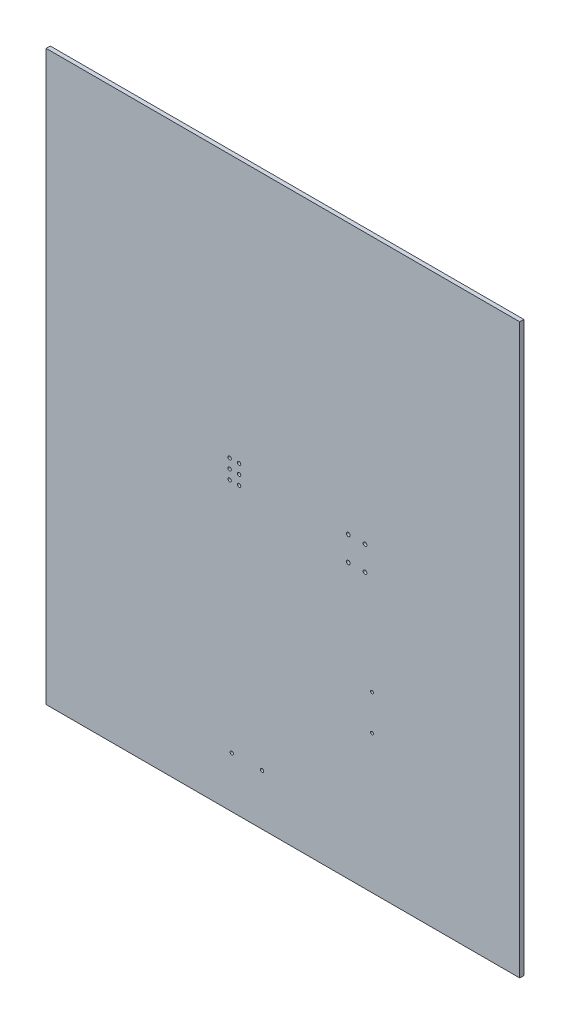
ISO-10303-21;
HEADER;
FILE_DESCRIPTION(('STEP AP214'),'2;1');
FILE_NAME('part.step','',(''),(''),'','','');
FILE_SCHEMA(('AUTOMOTIVE_DESIGN { 1 0 10303 214 1 1 1 1 }'));
ENDSEC;
DATA;
#1=APPLICATION_CONTEXT('core data for automotive mechanical design processes');
#2=APPLICATION_PROTOCOL_DEFINITION('international standard','automotive_design',2000,#1);
#3=PRODUCT_CONTEXT('',#1,'mechanical');
#4=PRODUCT('Part','Part','',(#3));
#5=PRODUCT_RELATED_PRODUCT_CATEGORY('part','',(#4));
#6=PRODUCT_DEFINITION_FORMATION('','',#4);
#7=PRODUCT_DEFINITION_CONTEXT('part definition',#1,'design');
#8=PRODUCT_DEFINITION('design','',#6,#7);
#9=PRODUCT_DEFINITION_SHAPE('','',#8);
#10=(LENGTH_UNIT() NAMED_UNIT(*) SI_UNIT(.MILLI.,.METRE.));
#11=(NAMED_UNIT(*) PLANE_ANGLE_UNIT() SI_UNIT($,.RADIAN.));
#12=(NAMED_UNIT(*) SI_UNIT($,.STERADIAN.) SOLID_ANGLE_UNIT());
#13=UNCERTAINTY_MEASURE_WITH_UNIT(LENGTH_MEASURE(1.E-05),#10,'distance_accuracy_value','');
#14=(GEOMETRIC_REPRESENTATION_CONTEXT(3) GLOBAL_UNCERTAINTY_ASSIGNED_CONTEXT((#13)) GLOBAL_UNIT_ASSIGNED_CONTEXT((#10,
#11,#12)) REPRESENTATION_CONTEXT('',''));
#15=CARTESIAN_POINT('',(0.,0.,0.));
#16=DIRECTION('',(0.,0.,1.));
#17=DIRECTION('',(1.,0.,0.));
#18=AXIS2_PLACEMENT_3D('',#15,#16,#17);
#19=CARTESIAN_POINT('',(25.4,25.4,1.10236));
#20=DIRECTION('',(0.,0.,1.));
#21=DIRECTION('',(1.,0.,0.));
#22=AXIS2_PLACEMENT_3D('',#19,#20,#21);
#23=PLANE('',#22);
#24=CARTESIAN_POINT('',(110.91120058,105.40880112,1.10236));
#25=DIRECTION('',(0.,0.,-1.));
#26=DIRECTION('',(-1.,0.,0.));
#27=AXIS2_PLACEMENT_3D('',#24,#25,#26);
#28=CIRCLE('',#27,0.499999);
#29=CARTESIAN_POINT('',(110.41120158,105.40880112,1.10236));
#30=VERTEX_POINT('',#29);
#31=EDGE_CURVE('E122',#30,#30,#28,.T.);
#32=ORIENTED_EDGE('',*,*,#31,.T.);
#33=EDGE_LOOP('',(#32));
#34=FACE_BOUND('',#33,.T.);
#35=CARTESIAN_POINT('',(110.91120058,98.90879888,1.10236));
#36=DIRECTION('',(0.,0.,-1.));
#37=DIRECTION('',(-1.,0.,0.));
#38=AXIS2_PLACEMENT_3D('',#35,#36,#37);
#39=CIRCLE('',#38,0.499999);
#40=CARTESIAN_POINT('',(110.41120158,98.90879888,1.10236));
#41=VERTEX_POINT('',#40);
#42=EDGE_CURVE('E125',#41,#41,#39,.T.);
#43=ORIENTED_EDGE('',*,*,#42,.T.);
#44=EDGE_LOOP('',(#43));
#45=FACE_BOUND('',#44,.T.);
#46=CARTESIAN_POINT('',(106.41119942,105.40880112,1.10236));
#47=DIRECTION('',(0.,0.,-1.));
#48=DIRECTION('',(-1.,0.,0.));
#49=AXIS2_PLACEMENT_3D('',#46,#47,#48);
#50=CIRCLE('',#49,0.499999);
#51=CARTESIAN_POINT('',(105.91120042,105.40880112,1.10236));
#52=VERTEX_POINT('',#51);
#53=EDGE_CURVE('E128',#52,#52,#50,.T.);
#54=ORIENTED_EDGE('',*,*,#53,.T.);
#55=EDGE_LOOP('',(#54));
#56=FACE_BOUND('',#55,.T.);
#57=CARTESIAN_POINT('',(106.41119942,98.90879888,1.10236));
#58=DIRECTION('',(0.,0.,-1.));
#59=DIRECTION('',(-1.,0.,0.));
#60=AXIS2_PLACEMENT_3D('',#57,#58,#59);
#61=CIRCLE('',#60,0.499999);
#62=CARTESIAN_POINT('',(105.91120042,98.90879888,1.10236));
#63=VERTEX_POINT('',#62);
#64=EDGE_CURVE('E131',#63,#63,#61,.T.);
#65=ORIENTED_EDGE('',*,*,#64,.T.);
#66=EDGE_LOOP('',(#65));
#67=FACE_BOUND('',#66,.T.);
#68=CARTESIAN_POINT('',(112.77499924,71.98799928,1.10236));
#69=DIRECTION('',(0.,0.,-1.));
#70=DIRECTION('',(-1.,0.,0.));
#71=AXIS2_PLACEMENT_3D('',#68,#69,#70);
#72=CIRCLE('',#71,0.381);
#73=CARTESIAN_POINT('',(112.39399924,71.98799928,1.10236));
#74=VERTEX_POINT('',#73);
#75=EDGE_CURVE('E134',#74,#74,#72,.T.);
#76=ORIENTED_EDGE('',*,*,#75,.T.);
#77=EDGE_LOOP('',(#76));
#78=FACE_BOUND('',#77,.T.);
#79=CARTESIAN_POINT('',(112.77499924,62.4624989,1.10236));
#80=DIRECTION('',(0.,0.,-1.));
#81=DIRECTION('',(-1.,0.,0.));
#82=AXIS2_PLACEMENT_3D('',#79,#80,#81);
#83=CIRCLE('',#82,0.381);
#84=CARTESIAN_POINT('',(112.39399924,62.4624989,1.10236));
#85=VERTEX_POINT('',#84);
#86=EDGE_CURVE('E137',#85,#85,#83,.T.);
#87=ORIENTED_EDGE('',*,*,#86,.T.);
#88=EDGE_LOOP('',(#87));
#89=FACE_BOUND('',#88,.T.);
#90=CARTESIAN_POINT('',(83.30299824,39.05000064,1.10236));
#91=DIRECTION('',(0.,0.,-1.));
#92=DIRECTION('',(-1.,0.,0.));
#93=AXIS2_PLACEMENT_3D('',#90,#91,#92);
#94=CIRCLE('',#93,0.4445);
#95=CARTESIAN_POINT('',(82.85849824,39.05000064,1.10236));
#96=VERTEX_POINT('',#95);
#97=EDGE_CURVE('E140',#96,#96,#94,.T.);
#98=ORIENTED_EDGE('',*,*,#97,.T.);
#99=EDGE_LOOP('',(#98));
#100=FACE_BOUND('',#99,.T.);
#101=CARTESIAN_POINT('',(77.14000066,107.2650001,1.10236));
#102=DIRECTION('',(0.,0.,-1.));
#103=DIRECTION('',(-1.,0.,0.));
#104=AXIS2_PLACEMENT_3D('',#101,#102,#103);
#105=CIRCLE('',#104,0.4499991);
#106=CARTESIAN_POINT('',(76.69000156,107.2650001,1.10236));
#107=VERTEX_POINT('',#106);
#108=EDGE_CURVE('E143',#107,#107,#105,.T.);
#109=ORIENTED_EDGE('',*,*,#108,.T.);
#110=EDGE_LOOP('',(#109));
#111=FACE_BOUND('',#110,.T.);
#112=CARTESIAN_POINT('',(77.14000066,104.7250001,1.10236));
#113=DIRECTION('',(0.,0.,-1.));
#114=DIRECTION('',(-1.,0.,0.));
#115=AXIS2_PLACEMENT_3D('',#112,#113,#114);
#116=CIRCLE('',#115,0.4499991);
#117=CARTESIAN_POINT('',(76.69000156,104.7250001,1.10236));
#118=VERTEX_POINT('',#117);
#119=EDGE_CURVE('E146',#118,#118,#116,.T.);
#120=ORIENTED_EDGE('',*,*,#119,.T.);
#121=EDGE_LOOP('',(#120));
#122=FACE_BOUND('',#121,.T.);
#123=CARTESIAN_POINT('',(74.60000066,107.2650001,1.10236));
#124=DIRECTION('',(0.,0.,-1.));
#125=DIRECTION('',(-1.,0.,0.));
#126=AXIS2_PLACEMENT_3D('',#123,#124,#125);
#127=CIRCLE('',#126,0.4499991);
#128=CARTESIAN_POINT('',(74.15000156,107.2650001,1.10236));
#129=VERTEX_POINT('',#128);
#130=EDGE_CURVE('E149',#129,#129,#127,.T.);
#131=ORIENTED_EDGE('',*,*,#130,.T.);
#132=EDGE_LOOP('',(#131));
#133=FACE_BOUND('',#132,.T.);
#134=CARTESIAN_POINT('',(74.60000066,104.7250001,1.10236));
#135=DIRECTION('',(0.,0.,-1.));
#136=DIRECTION('',(-1.,0.,0.));
#137=AXIS2_PLACEMENT_3D('',#134,#135,#136);
#138=CIRCLE('',#137,0.4499991);
#139=CARTESIAN_POINT('',(74.15000156,104.7250001,1.10236));
#140=VERTEX_POINT('',#139);
#141=EDGE_CURVE('E152',#140,#140,#138,.T.);
#142=ORIENTED_EDGE('',*,*,#141,.T.);
#143=EDGE_LOOP('',(#142));
#144=FACE_BOUND('',#143,.T.);
#145=CARTESIAN_POINT('',(77.14000066,102.1850001,1.10236));
#146=DIRECTION('',(0.,0.,-1.));
#147=DIRECTION('',(-1.,0.,0.));
#148=AXIS2_PLACEMENT_3D('',#145,#146,#147);
#149=CIRCLE('',#148,0.4499991);
#150=CARTESIAN_POINT('',(76.69000156,102.1850001,1.10236));
#151=VERTEX_POINT('',#150);
#152=EDGE_CURVE('E155',#151,#151,#149,.T.);
#153=ORIENTED_EDGE('',*,*,#152,.T.);
#154=EDGE_LOOP('',(#153));
#155=FACE_BOUND('',#154,.T.);
#156=CARTESIAN_POINT('',(75.17499824,39.05000064,1.10236));
#157=DIRECTION('',(0.,0.,-1.));
#158=DIRECTION('',(-1.,0.,0.));
#159=AXIS2_PLACEMENT_3D('',#156,#157,#158);
#160=CIRCLE('',#159,0.4445);
#161=CARTESIAN_POINT('',(74.73049824,39.05000064,1.10236));
#162=VERTEX_POINT('',#161);
#163=EDGE_CURVE('E157',#162,#162,#160,.T.);
#164=ORIENTED_EDGE('',*,*,#163,.T.);
#165=EDGE_LOOP('',(#164));
#166=FACE_BOUND('',#165,.T.);
#167=CARTESIAN_POINT('',(74.60000066,102.1850001,1.10236));
#168=DIRECTION('',(0.,0.,-1.));
#169=DIRECTION('',(-1.,0.,0.));
#170=AXIS2_PLACEMENT_3D('',#167,#168,#169);
#171=CIRCLE('',#170,0.4499991);
#172=CARTESIAN_POINT('',(74.15000156,102.1850001,1.10236));
#173=VERTEX_POINT('',#172);
#174=EDGE_CURVE('E20',#173,#173,#171,.T.);
#175=ORIENTED_EDGE('',*,*,#174,.T.);
#176=EDGE_LOOP('',(#175));
#177=FACE_BOUND('',#176,.T.);
#178=DIRECTION('',(1.,0.,0.));
#179=VECTOR('',#178,1.);
#180=CARTESIAN_POINT('',(25.4,177.8,1.10236));
#181=LINE('',#180,#179);
#182=CARTESIAN_POINT('',(25.4,177.8,1.10236));
#183=VERTEX_POINT('',#182);
#184=CARTESIAN_POINT('',(152.4,177.8,1.10236));
#185=VERTEX_POINT('',#184);
#186=EDGE_CURVE('E54',#183,#185,#181,.T.);
#187=ORIENTED_EDGE('',*,*,#186,.F.);
#188=DIRECTION('',(0.,1.,0.));
#189=VECTOR('',#188,1.);
#190=CARTESIAN_POINT('',(25.4,25.4,1.10236));
#191=LINE('',#190,#189);
#192=CARTESIAN_POINT('',(25.4,25.4,1.10236));
#193=VERTEX_POINT('',#192);
#194=EDGE_CURVE('E71',#193,#183,#191,.T.);
#195=ORIENTED_EDGE('',*,*,#194,.F.);
#196=DIRECTION('',(1.,0.,0.));
#197=VECTOR('',#196,1.);
#198=CARTESIAN_POINT('',(152.4,25.4,1.10236));
#199=LINE('',#198,#197);
#200=CARTESIAN_POINT('',(152.4,25.4,1.10236));
#201=VERTEX_POINT('',#200);
#202=EDGE_CURVE('E68',#201,#193,#199,.F.);
#203=ORIENTED_EDGE('',*,*,#202,.F.);
#204=DIRECTION('',(0.,1.,0.));
#205=VECTOR('',#204,1.);
#206=CARTESIAN_POINT('',(152.4,177.8,1.10236));
#207=LINE('',#206,#205);
#208=EDGE_CURVE('E59',#185,#201,#207,.F.);
#209=ORIENTED_EDGE('',*,*,#208,.F.);
#210=EDGE_LOOP('',(#187,#195,#203,#209));
#211=FACE_BOUND('',#210,.T.);
#212=ADVANCED_FACE('F17',(#34,#45,#56,#67,#78,#89,#100,#111,#122,#133,#144,#155,#166,#177,#211),
#23,.T.);
#213=CARTESIAN_POINT('',(152.4,25.4,0.));
#214=DIRECTION('',(0.,-1.,0.));
#215=DIRECTION('',(0.,0.,-1.));
#216=AXIS2_PLACEMENT_3D('',#213,#214,#215);
#217=PLANE('',#216);
#218=DIRECTION('',(0.,0.,1.));
#219=VECTOR('',#218,1.);
#220=CARTESIAN_POINT('',(25.4,25.4,0.));
#221=LINE('',#220,#219);
#222=CARTESIAN_POINT('',(25.4,25.4,0.));
#223=VERTEX_POINT('',#222);
#224=EDGE_CURVE('E165',#223,#193,#221,.T.);
#225=ORIENTED_EDGE('',*,*,#224,.F.);
#226=DIRECTION('',(1.,0.,0.));
#227=VECTOR('',#226,1.);
#228=CARTESIAN_POINT('',(25.4,25.4,0.));
#229=LINE('',#228,#227);
#230=CARTESIAN_POINT('',(152.4,25.4,0.));
#231=VERTEX_POINT('',#230);
#232=EDGE_CURVE('E78',#223,#231,#229,.T.);
#233=ORIENTED_EDGE('',*,*,#232,.T.);
#234=DIRECTION('',(0.,0.,-1.));
#235=VECTOR('',#234,1.);
#236=CARTESIAN_POINT('',(152.4,25.4,0.));
#237=LINE('',#236,#235);
#238=EDGE_CURVE('E64',#201,#231,#237,.T.);
#239=ORIENTED_EDGE('',*,*,#238,.F.);
#240=ORIENTED_EDGE('',*,*,#202,.T.);
#241=EDGE_LOOP('',(#225,#233,#239,#240));
#242=FACE_BOUND('',#241,.T.);
#243=ADVANCED_FACE('F77',(#242),#217,.T.);
#244=CARTESIAN_POINT('',(152.4,177.8,0.));
#245=DIRECTION('',(1.,0.,0.));
#246=DIRECTION('',(0.,0.,-1.));
#247=AXIS2_PLACEMENT_3D('',#244,#245,#246);
#248=PLANE('',#247);
#249=ORIENTED_EDGE('',*,*,#238,.T.);
#250=DIRECTION('',(0.,1.,0.));
#251=VECTOR('',#250,1.);
#252=CARTESIAN_POINT('',(152.4,25.4,0.));
#253=LINE('',#252,#251);
#254=CARTESIAN_POINT('',(152.4,177.8,0.));
#255=VERTEX_POINT('',#254);
#256=EDGE_CURVE('E176',#231,#255,#253,.T.);
#257=ORIENTED_EDGE('',*,*,#256,.T.);
#258=DIRECTION('',(0.,0.,1.));
#259=VECTOR('',#258,1.);
#260=CARTESIAN_POINT('',(152.4,177.8,0.));
#261=LINE('',#260,#259);
#262=EDGE_CURVE('E66',#185,#255,#261,.F.);
#263=ORIENTED_EDGE('',*,*,#262,.F.);
#264=ORIENTED_EDGE('',*,*,#208,.T.);
#265=EDGE_LOOP('',(#249,#257,#263,#264));
#266=FACE_BOUND('',#265,.T.);
#267=ADVANCED_FACE('F61',(#266),#248,.T.);
#268=CARTESIAN_POINT('',(25.4,177.8,0.));
#269=DIRECTION('',(0.,1.,0.));
#270=DIRECTION('',(0.,0.,1.));
#271=AXIS2_PLACEMENT_3D('',#268,#269,#270);
#272=PLANE('',#271);
#273=ORIENTED_EDGE('',*,*,#262,.T.);
#274=DIRECTION('',(1.,0.,0.));
#275=VECTOR('',#274,1.);
#276=CARTESIAN_POINT('',(25.4,177.8,0.));
#277=LINE('',#276,#275);
#278=CARTESIAN_POINT('',(25.4,177.8,0.));
#279=VERTEX_POINT('',#278);
#280=EDGE_CURVE('E173',#255,#279,#277,.F.);
#281=ORIENTED_EDGE('',*,*,#280,.T.);
#282=DIRECTION('',(0.,0.,1.));
#283=VECTOR('',#282,1.);
#284=CARTESIAN_POINT('',(25.4,177.8,0.));
#285=LINE('',#284,#283);
#286=EDGE_CURVE('E35',#183,#279,#285,.F.);
#287=ORIENTED_EDGE('',*,*,#286,.F.);
#288=ORIENTED_EDGE('',*,*,#186,.T.);
#289=EDGE_LOOP('',(#273,#281,#287,#288));
#290=FACE_BOUND('',#289,.T.);
#291=ADVANCED_FACE('F172',(#290),#272,.T.);
#292=CARTESIAN_POINT('',(25.4,25.4,0.));
#293=DIRECTION('',(-1.,0.,0.));
#294=DIRECTION('',(0.,0.,1.));
#295=AXIS2_PLACEMENT_3D('',#292,#293,#294);
#296=PLANE('',#295);
#297=ORIENTED_EDGE('',*,*,#286,.T.);
#298=DIRECTION('',(0.,1.,0.));
#299=VECTOR('',#298,1.);
#300=CARTESIAN_POINT('',(25.4,25.4,0.));
#301=LINE('',#300,#299);
#302=EDGE_CURVE('E121',#279,#223,#301,.F.);
#303=ORIENTED_EDGE('',*,*,#302,.T.);
#304=ORIENTED_EDGE('',*,*,#224,.T.);
#305=ORIENTED_EDGE('',*,*,#194,.T.);
#306=EDGE_LOOP('',(#297,#303,#304,#305));
#307=FACE_BOUND('',#306,.T.);
#308=ADVANCED_FACE('F179',(#307),#296,.T.);
#309=CARTESIAN_POINT('',(74.60000066,102.1850001,0.));
#310=DIRECTION('',(0.,0.,-1.));
#311=DIRECTION('',(-1.,0.,0.));
#312=AXIS2_PLACEMENT_3D('',#309,#310,#311);
#313=CYLINDRICAL_SURFACE('',#312,0.4499991);
#314=ORIENTED_EDGE('',*,*,#174,.F.);
#315=EDGE_LOOP('',(#314));
#316=FACE_BOUND('',#315,.T.);
#317=CARTESIAN_POINT('',(74.60000066,102.1850001,0.));
#318=DIRECTION('',(0.,0.,-1.));
#319=DIRECTION('',(-1.,0.,0.));
#320=AXIS2_PLACEMENT_3D('',#317,#318,#319);
#321=CIRCLE('',#320,0.4499991);
#322=CARTESIAN_POINT('',(74.15000156,102.1850001,0.));
#323=VERTEX_POINT('',#322);
#324=EDGE_CURVE('E118',#323,#323,#321,.F.);
#325=ORIENTED_EDGE('',*,*,#324,.F.);
#326=EDGE_LOOP('',(#325));
#327=FACE_BOUND('',#326,.T.);
#328=ADVANCED_FACE('F181',(#316,#327),#313,.F.);
#329=CARTESIAN_POINT('',(75.17499824,39.05000064,0.));
#330=DIRECTION('',(0.,0.,-1.));
#331=DIRECTION('',(-1.,0.,0.));
#332=AXIS2_PLACEMENT_3D('',#329,#330,#331);
#333=CYLINDRICAL_SURFACE('',#332,0.4445);
#334=ORIENTED_EDGE('',*,*,#163,.F.);
#335=EDGE_LOOP('',(#334));
#336=FACE_BOUND('',#335,.T.);
#337=CARTESIAN_POINT('',(75.17499824,39.05000064,0.));
#338=DIRECTION('',(0.,0.,-1.));
#339=DIRECTION('',(-1.,0.,0.));
#340=AXIS2_PLACEMENT_3D('',#337,#338,#339);
#341=CIRCLE('',#340,0.4445);
#342=CARTESIAN_POINT('',(74.73049824,39.05000064,0.));
#343=VERTEX_POINT('',#342);
#344=EDGE_CURVE('E115',#343,#343,#341,.F.);
#345=ORIENTED_EDGE('',*,*,#344,.F.);
#346=EDGE_LOOP('',(#345));
#347=FACE_BOUND('',#346,.T.);
#348=ADVANCED_FACE('F188',(#336,#347),#333,.F.);
#349=CARTESIAN_POINT('',(77.14000066,102.1850001,0.));
#350=DIRECTION('',(0.,0.,-1.));
#351=DIRECTION('',(-1.,0.,0.));
#352=AXIS2_PLACEMENT_3D('',#349,#350,#351);
#353=CYLINDRICAL_SURFACE('',#352,0.4499991);
#354=ORIENTED_EDGE('',*,*,#152,.F.);
#355=EDGE_LOOP('',(#354));
#356=FACE_BOUND('',#355,.T.);
#357=CARTESIAN_POINT('',(77.14000066,102.1850001,0.));
#358=DIRECTION('',(0.,0.,-1.));
#359=DIRECTION('',(-1.,0.,0.));
#360=AXIS2_PLACEMENT_3D('',#357,#358,#359);
#361=CIRCLE('',#360,0.4499991);
#362=CARTESIAN_POINT('',(76.69000156,102.1850001,0.));
#363=VERTEX_POINT('',#362);
#364=EDGE_CURVE('E112',#363,#363,#361,.F.);
#365=ORIENTED_EDGE('',*,*,#364,.F.);
#366=EDGE_LOOP('',(#365));
#367=FACE_BOUND('',#366,.T.);
#368=ADVANCED_FACE('F242',(#356,#367),#353,.F.);
#369=CARTESIAN_POINT('',(74.60000066,104.7250001,0.));
#370=DIRECTION('',(0.,0.,-1.));
#371=DIRECTION('',(-1.,0.,0.));
#372=AXIS2_PLACEMENT_3D('',#369,#370,#371);
#373=CYLINDRICAL_SURFACE('',#372,0.4499991);
#374=ORIENTED_EDGE('',*,*,#141,.F.);
#375=EDGE_LOOP('',(#374));
#376=FACE_BOUND('',#375,.T.);
#377=CARTESIAN_POINT('',(74.60000066,104.7250001,0.));
#378=DIRECTION('',(0.,0.,-1.));
#379=DIRECTION('',(-1.,0.,0.));
#380=AXIS2_PLACEMENT_3D('',#377,#378,#379);
#381=CIRCLE('',#380,0.4499991);
#382=CARTESIAN_POINT('',(74.15000156,104.7250001,0.));
#383=VERTEX_POINT('',#382);
#384=EDGE_CURVE('E109',#383,#383,#381,.F.);
#385=ORIENTED_EDGE('',*,*,#384,.F.);
#386=EDGE_LOOP('',(#385));
#387=FACE_BOUND('',#386,.T.);
#388=ADVANCED_FACE('F238',(#376,#387),#373,.F.);
#389=CARTESIAN_POINT('',(74.60000066,107.2650001,0.));
#390=DIRECTION('',(0.,0.,-1.));
#391=DIRECTION('',(-1.,0.,0.));
#392=AXIS2_PLACEMENT_3D('',#389,#390,#391);
#393=CYLINDRICAL_SURFACE('',#392,0.4499991);
#394=ORIENTED_EDGE('',*,*,#130,.F.);
#395=EDGE_LOOP('',(#394));
#396=FACE_BOUND('',#395,.T.);
#397=CARTESIAN_POINT('',(74.60000066,107.2650001,0.));
#398=DIRECTION('',(0.,0.,-1.));
#399=DIRECTION('',(-1.,0.,0.));
#400=AXIS2_PLACEMENT_3D('',#397,#398,#399);
#401=CIRCLE('',#400,0.4499991);
#402=CARTESIAN_POINT('',(74.15000156,107.2650001,0.));
#403=VERTEX_POINT('',#402);
#404=EDGE_CURVE('E106',#403,#403,#401,.F.);
#405=ORIENTED_EDGE('',*,*,#404,.F.);
#406=EDGE_LOOP('',(#405));
#407=FACE_BOUND('',#406,.T.);
#408=ADVANCED_FACE('F234',(#396,#407),#393,.F.);
#409=CARTESIAN_POINT('',(77.14000066,104.7250001,0.));
#410=DIRECTION('',(0.,0.,-1.));
#411=DIRECTION('',(-1.,0.,0.));
#412=AXIS2_PLACEMENT_3D('',#409,#410,#411);
#413=CYLINDRICAL_SURFACE('',#412,0.4499991);
#414=ORIENTED_EDGE('',*,*,#119,.F.);
#415=EDGE_LOOP('',(#414));
#416=FACE_BOUND('',#415,.T.);
#417=CARTESIAN_POINT('',(77.14000066,104.7250001,0.));
#418=DIRECTION('',(0.,0.,-1.));
#419=DIRECTION('',(-1.,0.,0.));
#420=AXIS2_PLACEMENT_3D('',#417,#418,#419);
#421=CIRCLE('',#420,0.4499991);
#422=CARTESIAN_POINT('',(76.69000156,104.7250001,0.));
#423=VERTEX_POINT('',#422);
#424=EDGE_CURVE('E103',#423,#423,#421,.F.);
#425=ORIENTED_EDGE('',*,*,#424,.F.);
#426=EDGE_LOOP('',(#425));
#427=FACE_BOUND('',#426,.T.);
#428=ADVANCED_FACE('F230',(#416,#427),#413,.F.);
#429=CARTESIAN_POINT('',(77.14000066,107.2650001,0.));
#430=DIRECTION('',(0.,0.,-1.));
#431=DIRECTION('',(-1.,0.,0.));
#432=AXIS2_PLACEMENT_3D('',#429,#430,#431);
#433=CYLINDRICAL_SURFACE('',#432,0.4499991);
#434=ORIENTED_EDGE('',*,*,#108,.F.);
#435=EDGE_LOOP('',(#434));
#436=FACE_BOUND('',#435,.T.);
#437=CARTESIAN_POINT('',(77.14000066,107.2650001,0.));
#438=DIRECTION('',(0.,0.,-1.));
#439=DIRECTION('',(-1.,0.,0.));
#440=AXIS2_PLACEMENT_3D('',#437,#438,#439);
#441=CIRCLE('',#440,0.4499991);
#442=CARTESIAN_POINT('',(76.69000156,107.2650001,0.));
#443=VERTEX_POINT('',#442);
#444=EDGE_CURVE('E100',#443,#443,#441,.F.);
#445=ORIENTED_EDGE('',*,*,#444,.F.);
#446=EDGE_LOOP('',(#445));
#447=FACE_BOUND('',#446,.T.);
#448=ADVANCED_FACE('F226',(#436,#447),#433,.F.);
#449=CARTESIAN_POINT('',(83.30299824,39.05000064,0.));
#450=DIRECTION('',(0.,0.,-1.));
#451=DIRECTION('',(-1.,0.,0.));
#452=AXIS2_PLACEMENT_3D('',#449,#450,#451);
#453=CYLINDRICAL_SURFACE('',#452,0.4445);
#454=ORIENTED_EDGE('',*,*,#97,.F.);
#455=EDGE_LOOP('',(#454));
#456=FACE_BOUND('',#455,.T.);
#457=CARTESIAN_POINT('',(83.30299824,39.05000064,0.));
#458=DIRECTION('',(0.,0.,-1.));
#459=DIRECTION('',(-1.,0.,0.));
#460=AXIS2_PLACEMENT_3D('',#457,#458,#459);
#461=CIRCLE('',#460,0.4445);
#462=CARTESIAN_POINT('',(82.85849824,39.05000064,0.));
#463=VERTEX_POINT('',#462);
#464=EDGE_CURVE('E97',#463,#463,#461,.F.);
#465=ORIENTED_EDGE('',*,*,#464,.F.);
#466=EDGE_LOOP('',(#465));
#467=FACE_BOUND('',#466,.T.);
#468=ADVANCED_FACE('F222',(#456,#467),#453,.F.);
#469=CARTESIAN_POINT('',(112.77499924,62.4624989,0.));
#470=DIRECTION('',(0.,0.,-1.));
#471=DIRECTION('',(-1.,0.,0.));
#472=AXIS2_PLACEMENT_3D('',#469,#470,#471);
#473=CYLINDRICAL_SURFACE('',#472,0.381);
#474=ORIENTED_EDGE('',*,*,#86,.F.);
#475=EDGE_LOOP('',(#474));
#476=FACE_BOUND('',#475,.T.);
#477=CARTESIAN_POINT('',(112.77499924,62.4624989,0.));
#478=DIRECTION('',(0.,0.,-1.));
#479=DIRECTION('',(-1.,0.,0.));
#480=AXIS2_PLACEMENT_3D('',#477,#478,#479);
#481=CIRCLE('',#480,0.381);
#482=CARTESIAN_POINT('',(112.39399924,62.4624989,0.));
#483=VERTEX_POINT('',#482);
#484=EDGE_CURVE('E94',#483,#483,#481,.F.);
#485=ORIENTED_EDGE('',*,*,#484,.F.);
#486=EDGE_LOOP('',(#485));
#487=FACE_BOUND('',#486,.T.);
#488=ADVANCED_FACE('F218',(#476,#487),#473,.F.);
#489=CARTESIAN_POINT('',(112.77499924,71.98799928,0.));
#490=DIRECTION('',(0.,0.,-1.));
#491=DIRECTION('',(-1.,0.,0.));
#492=AXIS2_PLACEMENT_3D('',#489,#490,#491);
#493=CYLINDRICAL_SURFACE('',#492,0.381);
#494=ORIENTED_EDGE('',*,*,#75,.F.);
#495=EDGE_LOOP('',(#494));
#496=FACE_BOUND('',#495,.T.);
#497=CARTESIAN_POINT('',(112.77499924,71.98799928,0.));
#498=DIRECTION('',(0.,0.,-1.));
#499=DIRECTION('',(-1.,0.,0.));
#500=AXIS2_PLACEMENT_3D('',#497,#498,#499);
#501=CIRCLE('',#500,0.381);
#502=CARTESIAN_POINT('',(112.39399924,71.98799928,0.));
#503=VERTEX_POINT('',#502);
#504=EDGE_CURVE('E91',#503,#503,#501,.F.);
#505=ORIENTED_EDGE('',*,*,#504,.F.);
#506=EDGE_LOOP('',(#505));
#507=FACE_BOUND('',#506,.T.);
#508=ADVANCED_FACE('F214',(#496,#507),#493,.F.);
#509=CARTESIAN_POINT('',(106.41119942,98.90879888,0.));
#510=DIRECTION('',(0.,0.,-1.));
#511=DIRECTION('',(-1.,0.,0.));
#512=AXIS2_PLACEMENT_3D('',#509,#510,#511);
#513=CYLINDRICAL_SURFACE('',#512,0.499999);
#514=ORIENTED_EDGE('',*,*,#64,.F.);
#515=EDGE_LOOP('',(#514));
#516=FACE_BOUND('',#515,.T.);
#517=CARTESIAN_POINT('',(106.41119942,98.90879888,0.));
#518=DIRECTION('',(0.,0.,-1.));
#519=DIRECTION('',(-1.,0.,0.));
#520=AXIS2_PLACEMENT_3D('',#517,#518,#519);
#521=CIRCLE('',#520,0.499999);
#522=CARTESIAN_POINT('',(105.91120042,98.90879888,0.));
#523=VERTEX_POINT('',#522);
#524=EDGE_CURVE('E88',#523,#523,#521,.F.);
#525=ORIENTED_EDGE('',*,*,#524,.F.);
#526=EDGE_LOOP('',(#525));
#527=FACE_BOUND('',#526,.T.);
#528=ADVANCED_FACE('F210',(#516,#527),#513,.F.);
#529=CARTESIAN_POINT('',(106.41119942,105.40880112,0.));
#530=DIRECTION('',(0.,0.,-1.));
#531=DIRECTION('',(-1.,0.,0.));
#532=AXIS2_PLACEMENT_3D('',#529,#530,#531);
#533=CYLINDRICAL_SURFACE('',#532,0.499999);
#534=ORIENTED_EDGE('',*,*,#53,.F.);
#535=EDGE_LOOP('',(#534));
#536=FACE_BOUND('',#535,.T.);
#537=CARTESIAN_POINT('',(106.41119942,105.40880112,0.));
#538=DIRECTION('',(0.,0.,-1.));
#539=DIRECTION('',(-1.,0.,0.));
#540=AXIS2_PLACEMENT_3D('',#537,#538,#539);
#541=CIRCLE('',#540,0.499999);
#542=CARTESIAN_POINT('',(105.91120042,105.40880112,0.));
#543=VERTEX_POINT('',#542);
#544=EDGE_CURVE('E85',#543,#543,#541,.F.);
#545=ORIENTED_EDGE('',*,*,#544,.F.);
#546=EDGE_LOOP('',(#545));
#547=FACE_BOUND('',#546,.T.);
#548=ADVANCED_FACE('F206',(#536,#547),#533,.F.);
#549=CARTESIAN_POINT('',(110.91120058,98.90879888,0.));
#550=DIRECTION('',(0.,0.,-1.));
#551=DIRECTION('',(-1.,0.,0.));
#552=AXIS2_PLACEMENT_3D('',#549,#550,#551);
#553=CYLINDRICAL_SURFACE('',#552,0.499999);
#554=ORIENTED_EDGE('',*,*,#42,.F.);
#555=EDGE_LOOP('',(#554));
#556=FACE_BOUND('',#555,.T.);
#557=CARTESIAN_POINT('',(110.91120058,98.90879888,0.));
#558=DIRECTION('',(0.,0.,-1.));
#559=DIRECTION('',(-1.,0.,0.));
#560=AXIS2_PLACEMENT_3D('',#557,#558,#559);
#561=CIRCLE('',#560,0.499999);
#562=CARTESIAN_POINT('',(110.41120158,98.90879888,0.));
#563=VERTEX_POINT('',#562);
#564=EDGE_CURVE('E26',#563,#563,#561,.F.);
#565=ORIENTED_EDGE('',*,*,#564,.F.);
#566=EDGE_LOOP('',(#565));
#567=FACE_BOUND('',#566,.T.);
#568=ADVANCED_FACE('F199',(#556,#567),#553,.F.);
#569=CARTESIAN_POINT('',(110.91120058,105.40880112,0.));
#570=DIRECTION('',(0.,0.,-1.));
#571=DIRECTION('',(-1.,0.,0.));
#572=AXIS2_PLACEMENT_3D('',#569,#570,#571);
#573=CYLINDRICAL_SURFACE('',#572,0.499999);
#574=ORIENTED_EDGE('',*,*,#31,.F.);
#575=EDGE_LOOP('',(#574));
#576=FACE_BOUND('',#575,.T.);
#577=CARTESIAN_POINT('',(110.91120058,105.40880112,0.));
#578=DIRECTION('',(0.,0.,-1.));
#579=DIRECTION('',(-1.,0.,0.));
#580=AXIS2_PLACEMENT_3D('',#577,#578,#579);
#581=CIRCLE('',#580,0.499999);
#582=CARTESIAN_POINT('',(110.41120158,105.40880112,0.));
#583=VERTEX_POINT('',#582);
#584=EDGE_CURVE('E11',#583,#583,#581,.F.);
#585=ORIENTED_EDGE('',*,*,#584,.F.);
#586=EDGE_LOOP('',(#585));
#587=FACE_BOUND('',#586,.T.);
#588=ADVANCED_FACE('F193',(#576,#587),#573,.F.);
#589=CARTESIAN_POINT('',(25.4,25.4,0.));
#590=DIRECTION('',(0.,0.,1.));
#591=DIRECTION('',(1.,0.,0.));
#592=AXIS2_PLACEMENT_3D('',#589,#590,#591);
#593=PLANE('',#592);
#594=ORIENTED_EDGE('',*,*,#584,.T.);
#595=EDGE_LOOP('',(#594));
#596=FACE_BOUND('',#595,.T.);
#597=ORIENTED_EDGE('',*,*,#564,.T.);
#598=EDGE_LOOP('',(#597));
#599=FACE_BOUND('',#598,.T.);
#600=ORIENTED_EDGE('',*,*,#544,.T.);
#601=EDGE_LOOP('',(#600));
#602=FACE_BOUND('',#601,.T.);
#603=ORIENTED_EDGE('',*,*,#524,.T.);
#604=EDGE_LOOP('',(#603));
#605=FACE_BOUND('',#604,.T.);
#606=ORIENTED_EDGE('',*,*,#504,.T.);
#607=EDGE_LOOP('',(#606));
#608=FACE_BOUND('',#607,.T.);
#609=ORIENTED_EDGE('',*,*,#484,.T.);
#610=EDGE_LOOP('',(#609));
#611=FACE_BOUND('',#610,.T.);
#612=ORIENTED_EDGE('',*,*,#464,.T.);
#613=EDGE_LOOP('',(#612));
#614=FACE_BOUND('',#613,.T.);
#615=ORIENTED_EDGE('',*,*,#444,.T.);
#616=EDGE_LOOP('',(#615));
#617=FACE_BOUND('',#616,.T.);
#618=ORIENTED_EDGE('',*,*,#424,.T.);
#619=EDGE_LOOP('',(#618));
#620=FACE_BOUND('',#619,.T.);
#621=ORIENTED_EDGE('',*,*,#404,.T.);
#622=EDGE_LOOP('',(#621));
#623=FACE_BOUND('',#622,.T.);
#624=ORIENTED_EDGE('',*,*,#384,.T.);
#625=EDGE_LOOP('',(#624));
#626=FACE_BOUND('',#625,.T.);
#627=ORIENTED_EDGE('',*,*,#364,.T.);
#628=EDGE_LOOP('',(#627));
#629=FACE_BOUND('',#628,.T.);
#630=ORIENTED_EDGE('',*,*,#344,.T.);
#631=EDGE_LOOP('',(#630));
#632=FACE_BOUND('',#631,.T.);
#633=ORIENTED_EDGE('',*,*,#324,.T.);
#634=EDGE_LOOP('',(#633));
#635=FACE_BOUND('',#634,.T.);
#636=ORIENTED_EDGE('',*,*,#280,.F.);
#637=ORIENTED_EDGE('',*,*,#256,.F.);
#638=ORIENTED_EDGE('',*,*,#232,.F.);
#639=ORIENTED_EDGE('',*,*,#302,.F.);
#640=EDGE_LOOP('',(#636,#637,#638,#639));
#641=FACE_BOUND('',#640,.T.);
#642=ADVANCED_FACE('F175',(#596,#599,#602,#605,#608,#611,#614,#617,#620,#623,#626,#629,#632,
#635,#641),#593,.F.);
#643=CLOSED_SHELL('',(#212,#243,#267,#291,#308,#328,#348,#368,#388,#408,#428,#448,#468,#488,
#508,#528,#548,#568,#588,#642));
#644=MANIFOLD_SOLID_BREP('B1',#643);
#645=ADVANCED_BREP_SHAPE_REPRESENTATION('',(#18,#644),#14);
#646=SHAPE_DEFINITION_REPRESENTATION(#9,#645);
ENDSEC;
END-ISO-10303-21;
